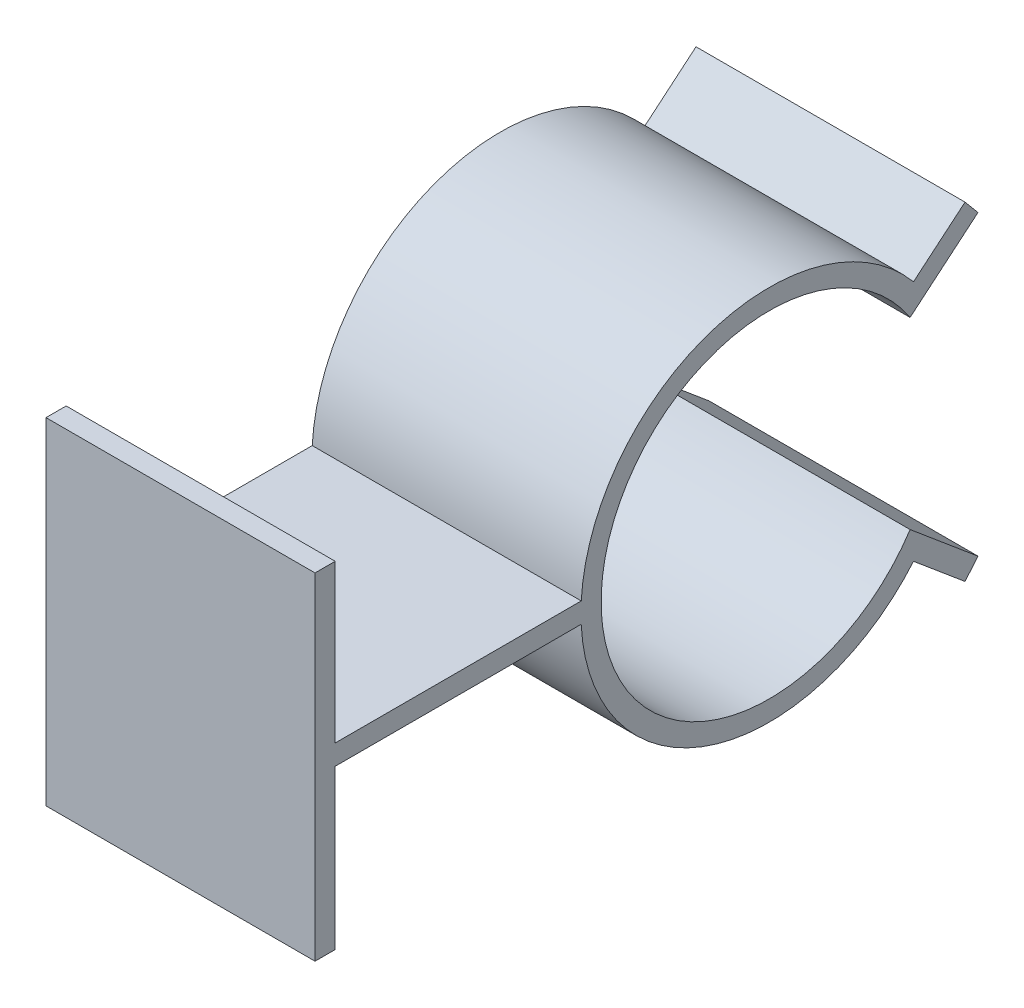
ISO-10303-21;
HEADER;
FILE_DESCRIPTION(('STEP AP214'),'2;1');
FILE_NAME('part.step','',(''),(''),'','','');
FILE_SCHEMA(('AUTOMOTIVE_DESIGN { 1 0 10303 214 1 1 1 1 }'));
ENDSEC;
DATA;
#1=APPLICATION_CONTEXT('core data for automotive mechanical design processes');
#2=APPLICATION_PROTOCOL_DEFINITION('international standard','automotive_design',2000,#1);
#3=PRODUCT_CONTEXT('',#1,'mechanical');
#4=PRODUCT('Part','Part','',(#3));
#5=PRODUCT_RELATED_PRODUCT_CATEGORY('part','',(#4));
#6=PRODUCT_DEFINITION_FORMATION('','',#4);
#7=PRODUCT_DEFINITION_CONTEXT('part definition',#1,'design');
#8=PRODUCT_DEFINITION('design','',#6,#7);
#9=PRODUCT_DEFINITION_SHAPE('','',#8);
#10=(LENGTH_UNIT() NAMED_UNIT(*) SI_UNIT(.MILLI.,.METRE.));
#11=(NAMED_UNIT(*) PLANE_ANGLE_UNIT() SI_UNIT($,.RADIAN.));
#12=(NAMED_UNIT(*) SI_UNIT($,.STERADIAN.) SOLID_ANGLE_UNIT());
#13=UNCERTAINTY_MEASURE_WITH_UNIT(LENGTH_MEASURE(1.E-05),#10,'distance_accuracy_value','');
#14=(GEOMETRIC_REPRESENTATION_CONTEXT(3) GLOBAL_UNCERTAINTY_ASSIGNED_CONTEXT((#13)) GLOBAL_UNIT_ASSIGNED_CONTEXT((#10,
#11,#12)) REPRESENTATION_CONTEXT('',''));
#15=CARTESIAN_POINT('',(0.,0.,0.));
#16=DIRECTION('',(0.,0.,1.));
#17=DIRECTION('',(1.,0.,0.));
#18=AXIS2_PLACEMENT_3D('',#15,#16,#17);
#19=CARTESIAN_POINT('',(362.500000000001,655.801592781711,0.));
#20=DIRECTION('',(0.,-1.,0.));
#21=DIRECTION('',(1.,0.,0.));
#22=AXIS2_PLACEMENT_3D('',#19,#20,#21);
#23=PLANE('',#22);
#24=DIRECTION('',(0.,0.,-1.));
#25=VECTOR('',#24,1.);
#26=CARTESIAN_POINT('',(382.500000000001,655.801592781711,0.));
#27=LINE('',#26,#25);
#28=CARTESIAN_POINT('',(382.500000000001,655.801592781711,32.2691453664121));
#29=VERTEX_POINT('',#28);
#30=CARTESIAN_POINT('',(382.500000000001,655.801592781711,13.9770329116128));
#31=VERTEX_POINT('',#30);
#32=EDGE_CURVE('E179',#29,#31,#27,.T.);
#33=ORIENTED_EDGE('',*,*,#32,.T.);
#34=DIRECTION('',(1.,0.,0.));
#35=VECTOR('',#34,1.);
#36=CARTESIAN_POINT('',(362.500000000001,655.801592781711,13.9770329116128));
#37=LINE('',#36,#35);
#38=CARTESIAN_POINT('',(362.500000000001,655.801592781711,13.9770329116128));
#39=VERTEX_POINT('',#38);
#40=EDGE_CURVE('E11',#39,#31,#37,.T.);
#41=ORIENTED_EDGE('',*,*,#40,.F.);
#42=DIRECTION('',(0.,0.,-1.));
#43=VECTOR('',#42,1.);
#44=CARTESIAN_POINT('',(362.500000000001,655.801592781711,0.));
#45=LINE('',#44,#43);
#46=CARTESIAN_POINT('',(362.500000000001,655.801592781711,32.2691453664121));
#47=VERTEX_POINT('',#46);
#48=EDGE_CURVE('E218',#47,#39,#45,.T.);
#49=ORIENTED_EDGE('',*,*,#48,.F.);
#50=DIRECTION('',(1.,0.,0.));
#51=VECTOR('',#50,1.);
#52=CARTESIAN_POINT('',(362.500000000001,655.801592781711,32.2691453664121));
#53=LINE('',#52,#51);
#54=EDGE_CURVE('E178',#47,#29,#53,.T.);
#55=ORIENTED_EDGE('',*,*,#54,.T.);
#56=EDGE_LOOP('',(#33,#41,#49,#55));
#57=FACE_BOUND('',#56,.T.);
#58=ADVANCED_FACE('F34',(#57),#23,.F.);
#59=CARTESIAN_POINT('',(362.500000000001,655.,0.));
#60=DIRECTION('',(1.,0.,0.));
#61=DIRECTION('',(0.,1.,0.));
#62=AXIS2_PLACEMENT_3D('',#59,#60,#61);
#63=CYLINDRICAL_SURFACE('',#62,14.);
#64=CARTESIAN_POINT('',(382.500000000001,655.,0.));
#65=DIRECTION('',(-1.,0.,0.));
#66=DIRECTION('',(0.,0.,1.));
#67=AXIS2_PLACEMENT_3D('',#64,#65,#66);
#68=CIRCLE('',#67,14.);
#69=CARTESIAN_POINT('',(382.500000000001,663.999026535612,-10.7246222036657));
#70=VERTEX_POINT('',#69);
#71=EDGE_CURVE('E182',#31,#70,#68,.T.);
#72=ORIENTED_EDGE('',*,*,#71,.T.);
#73=DIRECTION('',(1.,0.,0.));
#74=VECTOR('',#73,1.);
#75=CARTESIAN_POINT('',(362.500000000001,663.999026535612,-10.7246222036657));
#76=LINE('',#75,#74);
#77=CARTESIAN_POINT('',(362.500000000001,663.999026535612,-10.7246222036657));
#78=VERTEX_POINT('',#77);
#79=EDGE_CURVE('E42',#78,#70,#76,.T.);
#80=ORIENTED_EDGE('',*,*,#79,.F.);
#81=CARTESIAN_POINT('',(362.500000000001,655.,0.));
#82=DIRECTION('',(-1.,0.,0.));
#83=DIRECTION('',(0.,0.,1.));
#84=AXIS2_PLACEMENT_3D('',#81,#82,#83);
#85=CIRCLE('',#84,14.);
#86=EDGE_CURVE('E116',#39,#78,#85,.T.);
#87=ORIENTED_EDGE('',*,*,#86,.F.);
#88=ORIENTED_EDGE('',*,*,#40,.T.);
#89=EDGE_LOOP('',(#72,#80,#87,#88));
#90=FACE_BOUND('',#89,.T.);
#91=ADVANCED_FACE('F309',(#90),#63,.T.);
#92=CARTESIAN_POINT('',(362.500000000001,384.369778185915,322.524539111499));
#93=DIRECTION('',(0.,-0.766044443118973,-0.642787609686545));
#94=DIRECTION('',(0.,0.642787609686545,-0.766044443118973));
#95=AXIS2_PLACEMENT_3D('',#92,#93,#94);
#96=PLANE('',#95);
#97=DIRECTION('',(0.,0.642787609686545,-0.766044443118973));
#98=VECTOR('',#97,1.);
#99=CARTESIAN_POINT('',(382.500000000001,384.369778185915,322.524539111499));
#100=LINE('',#99,#98);
#101=CARTESIAN_POINT('',(382.500000000001,667.212964584045,-14.5548444192606));
#102=VERTEX_POINT('',#101);
#103=EDGE_CURVE('E184',#70,#102,#100,.T.);
#104=ORIENTED_EDGE('',*,*,#103,.T.);
#105=DIRECTION('',(1.,0.,0.));
#106=VECTOR('',#105,1.);
#107=CARTESIAN_POINT('',(362.500000000001,667.212964584045,-14.5548444192606));
#108=LINE('',#107,#106);
#109=CARTESIAN_POINT('',(362.500000000001,667.212964584045,-14.5548444192606));
#110=VERTEX_POINT('',#109);
#111=EDGE_CURVE('E241',#110,#102,#108,.T.);
#112=ORIENTED_EDGE('',*,*,#111,.F.);
#113=DIRECTION('',(0.,0.642787609686545,-0.766044443118973));
#114=VECTOR('',#113,1.);
#115=CARTESIAN_POINT('',(362.500000000001,384.369778185915,322.524539111499));
#116=LINE('',#115,#114);
#117=EDGE_CURVE('E249',#78,#110,#116,.T.);
#118=ORIENTED_EDGE('',*,*,#117,.F.);
#119=ORIENTED_EDGE('',*,*,#79,.T.);
#120=EDGE_LOOP('',(#104,#112,#118,#119));
#121=FACE_BOUND('',#120,.T.);
#122=ADVANCED_FACE('F247',(#121),#96,.F.);
#123=CARTESIAN_POINT('',(362.500000000001,282.843186398093,-337.079383530754));
#124=DIRECTION('',(0.,-0.642787609686503,0.766044443119009));
#125=DIRECTION('',(0.,-0.766044443119009,-0.642787609686503));
#126=AXIS2_PLACEMENT_3D('',#123,#124,#125);
#127=PLANE('',#126);
#128=DIRECTION('',(0.,-0.766044443119009,-0.642787609686503));
#129=VECTOR('',#128,1.);
#130=CARTESIAN_POINT('',(382.500000000001,282.843186398093,-337.079383530754));
#131=LINE('',#130,#129);
#132=CARTESIAN_POINT('',(382.500000000001,666.063897919366,-15.5190258337903));
#133=VERTEX_POINT('',#132);
#134=EDGE_CURVE('E186',#102,#133,#131,.T.);
#135=ORIENTED_EDGE('',*,*,#134,.T.);
#136=DIRECTION('',(1.,0.,0.));
#137=VECTOR('',#136,1.);
#138=CARTESIAN_POINT('',(362.500000000001,666.063897919366,-15.5190258337903));
#139=LINE('',#138,#137);
#140=CARTESIAN_POINT('',(362.500000000001,666.063897919366,-15.5190258337903));
#141=VERTEX_POINT('',#140);
#142=EDGE_CURVE('E238',#141,#133,#139,.T.);
#143=ORIENTED_EDGE('',*,*,#142,.F.);
#144=DIRECTION('',(0.,-0.766044443119009,-0.642787609686503));
#145=VECTOR('',#144,1.);
#146=CARTESIAN_POINT('',(362.500000000001,282.843186398093,-337.079383530754));
#147=LINE('',#146,#145);
#148=EDGE_CURVE('E267',#110,#141,#147,.T.);
#149=ORIENTED_EDGE('',*,*,#148,.F.);
#150=ORIENTED_EDGE('',*,*,#111,.T.);
#151=EDGE_LOOP('',(#135,#143,#149,#150));
#152=FACE_BOUND('',#151,.T.);
#153=ADVANCED_FACE('F257',(#152),#127,.F.);
#154=CARTESIAN_POINT('',(362.500000000001,383.220711521241,321.560357696968));
#155=DIRECTION('',(0.,0.766044443118977,0.64278760968654));
#156=DIRECTION('',(0.,-0.64278760968654,0.766044443118977));
#157=AXIS2_PLACEMENT_3D('',#154,#155,#156);
#158=PLANE('',#157);
#159=DIRECTION('',(0.,-0.64278760968654,0.766044443118977));
#160=VECTOR('',#159,1.);
#161=CARTESIAN_POINT('',(382.500000000001,383.220711521241,321.560357696968));
#162=LINE('',#161,#160);
#163=CARTESIAN_POINT('',(382.500000000001,661.827717795218,-10.4705429519611));
#164=VERTEX_POINT('',#163);
#165=EDGE_CURVE('E188',#133,#164,#162,.T.);
#166=ORIENTED_EDGE('',*,*,#165,.T.);
#167=DIRECTION('',(1.,0.,0.));
#168=VECTOR('',#167,1.);
#169=CARTESIAN_POINT('',(362.500000000001,661.827717795218,-10.4705429519611));
#170=LINE('',#169,#168);
#171=CARTESIAN_POINT('',(362.500000000001,661.827717795218,-10.4705429519611));
#172=VERTEX_POINT('',#171);
#173=EDGE_CURVE('E236',#172,#164,#170,.T.);
#174=ORIENTED_EDGE('',*,*,#173,.F.);
#175=DIRECTION('',(0.,-0.64278760968654,0.766044443118977));
#176=VECTOR('',#175,1.);
#177=CARTESIAN_POINT('',(362.500000000001,383.220711521241,321.560357696968));
#178=LINE('',#177,#176);
#179=EDGE_CURVE('E263',#141,#172,#178,.T.);
#180=ORIENTED_EDGE('',*,*,#179,.F.);
#181=ORIENTED_EDGE('',*,*,#142,.T.);
#182=EDGE_LOOP('',(#166,#174,#180,#181));
#183=FACE_BOUND('',#182,.T.);
#184=ADVANCED_FACE('F261',(#183),#158,.F.);
#185=CARTESIAN_POINT('',(362.500000000001,655.,0.));
#186=DIRECTION('',(1.,0.,0.));
#187=DIRECTION('',(0.,1.,0.));
#188=AXIS2_PLACEMENT_3D('',#185,#186,#187);
#189=CYLINDRICAL_SURFACE('',#188,12.4999999999999);
#190=CARTESIAN_POINT('',(382.500000000001,655.,0.));
#191=DIRECTION('',(-1.,0.,0.));
#192=DIRECTION('',(0.,0.,1.));
#193=AXIS2_PLACEMENT_3D('',#190,#191,#192);
#194=CIRCLE('',#193,12.4999999999999);
#195=CARTESIAN_POINT('',(382.500000000001,648.172282204782,-10.4705429519611));
#196=VERTEX_POINT('',#195);
#197=EDGE_CURVE('E191',#196,#164,#194,.T.);
#198=ORIENTED_EDGE('',*,*,#197,.F.);
#199=DIRECTION('',(1.,0.,0.));
#200=VECTOR('',#199,1.);
#201=CARTESIAN_POINT('',(362.500000000001,648.172282204782,-10.4705429519611));
#202=LINE('',#201,#200);
#203=CARTESIAN_POINT('',(362.500000000001,648.172282204782,-10.4705429519611));
#204=VERTEX_POINT('',#203);
#205=EDGE_CURVE('E234',#204,#196,#202,.T.);
#206=ORIENTED_EDGE('',*,*,#205,.F.);
#207=CARTESIAN_POINT('',(362.500000000001,655.,0.));
#208=DIRECTION('',(-1.,0.,0.));
#209=DIRECTION('',(0.,0.,1.));
#210=AXIS2_PLACEMENT_3D('',#207,#208,#209);
#211=CIRCLE('',#210,12.4999999999999);
#212=EDGE_CURVE('E266',#204,#172,#211,.T.);
#213=ORIENTED_EDGE('',*,*,#212,.T.);
#214=ORIENTED_EDGE('',*,*,#173,.T.);
#215=EDGE_LOOP('',(#198,#206,#213,#214));
#216=FACE_BOUND('',#215,.T.);
#217=ADVANCED_FACE('F322',(#216),#189,.F.);
#218=CARTESIAN_POINT('',(362.500000000001,385.518844850598,-323.488720526028));
#219=DIRECTION('',(0.,0.766044443118977,-0.64278760968654));
#220=DIRECTION('',(0.,0.64278760968654,0.766044443118977));
#221=AXIS2_PLACEMENT_3D('',#218,#219,#220);
#222=PLANE('',#221);
#223=DIRECTION('',(0.,0.64278760968654,0.766044443118977));
#224=VECTOR('',#223,1.);
#225=CARTESIAN_POINT('',(382.500000000001,385.518844850598,-323.488720526028));
#226=LINE('',#225,#224);
#227=CARTESIAN_POINT('',(382.500000000001,643.936102080635,-15.5190258337904));
#228=VERTEX_POINT('',#227);
#229=EDGE_CURVE('E194',#228,#196,#226,.T.);
#230=ORIENTED_EDGE('',*,*,#229,.F.);
#231=DIRECTION('',(1.,0.,0.));
#232=VECTOR('',#231,1.);
#233=CARTESIAN_POINT('',(362.500000000001,643.936102080635,-15.5190258337904));
#234=LINE('',#233,#232);
#235=CARTESIAN_POINT('',(362.500000000001,643.936102080635,-15.5190258337904));
#236=VERTEX_POINT('',#235);
#237=EDGE_CURVE('E232',#236,#228,#234,.T.);
#238=ORIENTED_EDGE('',*,*,#237,.F.);
#239=DIRECTION('',(0.,0.64278760968654,0.766044443118977));
#240=VECTOR('',#239,1.);
#241=CARTESIAN_POINT('',(362.500000000001,385.518844850598,-323.488720526028));
#242=LINE('',#241,#240);
#243=EDGE_CURVE('E269',#236,#204,#242,.T.);
#244=ORIENTED_EDGE('',*,*,#243,.T.);
#245=ORIENTED_EDGE('',*,*,#205,.T.);
#246=EDGE_LOOP('',(#230,#238,#244,#245));
#247=FACE_BOUND('',#246,.T.);
#248=ADVANCED_FACE('F325',(#247),#222,.T.);
#249=CARTESIAN_POINT('',(362.500000000001,258.417257230006,307.969694692232));
#250=DIRECTION('',(0.,-0.642787609686503,-0.766044443119009));
#251=DIRECTION('',(0.,0.766044443119009,-0.642787609686503));
#252=AXIS2_PLACEMENT_3D('',#249,#250,#251);
#253=PLANE('',#252);
#254=DIRECTION('',(0.,0.766044443119009,-0.642787609686503));
#255=VECTOR('',#254,1.);
#256=CARTESIAN_POINT('',(382.500000000001,258.417257230006,307.969694692232));
#257=LINE('',#256,#255);
#258=CARTESIAN_POINT('',(382.500000000001,642.787035415956,-14.5548444192605));
#259=VERTEX_POINT('',#258);
#260=EDGE_CURVE('E197',#259,#228,#257,.T.);
#261=ORIENTED_EDGE('',*,*,#260,.F.);
#262=DIRECTION('',(1.,0.,0.));
#263=VECTOR('',#262,1.);
#264=CARTESIAN_POINT('',(362.500000000001,642.787035415956,-14.5548444192605));
#265=LINE('',#264,#263);
#266=CARTESIAN_POINT('',(362.500000000001,642.787035415956,-14.5548444192605));
#267=VERTEX_POINT('',#266);
#268=EDGE_CURVE('E230',#267,#259,#265,.T.);
#269=ORIENTED_EDGE('',*,*,#268,.F.);
#270=DIRECTION('',(0.,0.766044443119009,-0.642787609686503));
#271=VECTOR('',#270,1.);
#272=CARTESIAN_POINT('',(362.500000000001,258.417257230006,307.969694692232));
#273=LINE('',#272,#271);
#274=EDGE_CURVE('E276',#267,#236,#273,.T.);
#275=ORIENTED_EDGE('',*,*,#274,.T.);
#276=ORIENTED_EDGE('',*,*,#237,.T.);
#277=EDGE_LOOP('',(#261,#269,#275,#276));
#278=FACE_BOUND('',#277,.T.);
#279=ADVANCED_FACE('F329',(#278),#253,.T.);
#280=CARTESIAN_POINT('',(362.500000000001,384.369778185915,-322.524539111499));
#281=DIRECTION('',(0.,-0.766044443118973,0.642787609686545));
#282=DIRECTION('',(0.,-0.642787609686545,-0.766044443118973));
#283=AXIS2_PLACEMENT_3D('',#280,#281,#282);
#284=PLANE('',#283);
#285=DIRECTION('',(0.,-0.642787609686545,-0.766044443118973));
#286=VECTOR('',#285,1.);
#287=CARTESIAN_POINT('',(382.500000000001,384.369778185915,-322.524539111499));
#288=LINE('',#287,#286);
#289=CARTESIAN_POINT('',(382.500000000001,646.000973464389,-10.7246222036657));
#290=VERTEX_POINT('',#289);
#291=EDGE_CURVE('E200',#290,#259,#288,.T.);
#292=ORIENTED_EDGE('',*,*,#291,.F.);
#293=DIRECTION('',(1.,0.,0.));
#294=VECTOR('',#293,1.);
#295=CARTESIAN_POINT('',(362.500000000001,646.000973464389,-10.7246222036657));
#296=LINE('',#295,#294);
#297=CARTESIAN_POINT('',(362.500000000001,646.000973464389,-10.7246222036657));
#298=VERTEX_POINT('',#297);
#299=EDGE_CURVE('E228',#298,#290,#296,.T.);
#300=ORIENTED_EDGE('',*,*,#299,.F.);
#301=DIRECTION('',(0.,-0.642787609686545,-0.766044443118973));
#302=VECTOR('',#301,1.);
#303=CARTESIAN_POINT('',(362.500000000001,384.369778185915,-322.524539111499));
#304=LINE('',#303,#302);
#305=EDGE_CURVE('E279',#298,#267,#304,.T.);
#306=ORIENTED_EDGE('',*,*,#305,.T.);
#307=ORIENTED_EDGE('',*,*,#268,.T.);
#308=EDGE_LOOP('',(#292,#300,#306,#307));
#309=FACE_BOUND('',#308,.T.);
#310=ADVANCED_FACE('F333',(#309),#284,.T.);
#311=CARTESIAN_POINT('',(362.500000000001,655.,0.));
#312=DIRECTION('',(1.,0.,0.));
#313=DIRECTION('',(0.,1.,0.));
#314=AXIS2_PLACEMENT_3D('',#311,#312,#313);
#315=CYLINDRICAL_SURFACE('',#314,14.);
#316=CARTESIAN_POINT('',(382.500000000001,655.,0.));
#317=DIRECTION('',(-1.,0.,0.));
#318=DIRECTION('',(0.,0.,1.));
#319=AXIS2_PLACEMENT_3D('',#316,#317,#318);
#320=CIRCLE('',#319,14.);
#321=CARTESIAN_POINT('',(382.500000000001,654.301592781711,13.9825686966823));
#322=VERTEX_POINT('',#321);
#323=EDGE_CURVE('E203',#290,#322,#320,.T.);
#324=ORIENTED_EDGE('',*,*,#323,.T.);
#325=DIRECTION('',(1.,0.,0.));
#326=VECTOR('',#325,1.);
#327=CARTESIAN_POINT('',(362.500000000001,654.301592781711,13.9825686966823));
#328=LINE('',#327,#326);
#329=CARTESIAN_POINT('',(362.500000000001,654.301592781711,13.9825686966823));
#330=VERTEX_POINT('',#329);
#331=EDGE_CURVE('E226',#330,#322,#328,.T.);
#332=ORIENTED_EDGE('',*,*,#331,.F.);
#333=CARTESIAN_POINT('',(362.500000000001,655.,0.));
#334=DIRECTION('',(-1.,0.,0.));
#335=DIRECTION('',(0.,0.,1.));
#336=AXIS2_PLACEMENT_3D('',#333,#334,#335);
#337=CIRCLE('',#336,14.);
#338=EDGE_CURVE('E282',#298,#330,#337,.T.);
#339=ORIENTED_EDGE('',*,*,#338,.F.);
#340=ORIENTED_EDGE('',*,*,#299,.T.);
#341=EDGE_LOOP('',(#324,#332,#339,#340));
#342=FACE_BOUND('',#341,.T.);
#343=ADVANCED_FACE('F337',(#342),#315,.T.);
#344=CARTESIAN_POINT('',(362.500000000001,654.301592781711,0.));
#345=DIRECTION('',(0.,-1.,0.));
#346=DIRECTION('',(1.,0.,0.));
#347=AXIS2_PLACEMENT_3D('',#344,#345,#346);
#348=PLANE('',#347);
#349=DIRECTION('',(0.,0.,-1.));
#350=VECTOR('',#349,1.);
#351=CARTESIAN_POINT('',(382.500000000001,654.301592781711,0.));
#352=LINE('',#351,#350);
#353=CARTESIAN_POINT('',(382.500000000001,654.301592781711,32.2691453664121));
#354=VERTEX_POINT('',#353);
#355=EDGE_CURVE('E206',#354,#322,#352,.T.);
#356=ORIENTED_EDGE('',*,*,#355,.F.);
#357=DIRECTION('',(1.,0.,0.));
#358=VECTOR('',#357,1.);
#359=CARTESIAN_POINT('',(362.500000000001,654.301592781711,32.2691453664121));
#360=LINE('',#359,#358);
#361=CARTESIAN_POINT('',(362.500000000001,654.301592781711,32.2691453664121));
#362=VERTEX_POINT('',#361);
#363=EDGE_CURVE('E224',#362,#354,#360,.T.);
#364=ORIENTED_EDGE('',*,*,#363,.F.);
#365=DIRECTION('',(0.,0.,-1.));
#366=VECTOR('',#365,1.);
#367=CARTESIAN_POINT('',(362.500000000001,654.301592781711,0.));
#368=LINE('',#367,#366);
#369=EDGE_CURVE('E284',#362,#330,#368,.T.);
#370=ORIENTED_EDGE('',*,*,#369,.T.);
#371=ORIENTED_EDGE('',*,*,#331,.T.);
#372=EDGE_LOOP('',(#356,#364,#370,#371));
#373=FACE_BOUND('',#372,.T.);
#374=ADVANCED_FACE('F341',(#373),#348,.T.);
#375=CARTESIAN_POINT('',(362.500000000001,0.,32.2691453664121));
#376=DIRECTION('',(0.,0.,1.));
#377=DIRECTION('',(1.,0.,0.));
#378=AXIS2_PLACEMENT_3D('',#375,#376,#377);
#379=PLANE('',#378);
#380=DIRECTION('',(0.,-1.,0.));
#381=VECTOR('',#380,1.);
#382=CARTESIAN_POINT('',(382.500000000001,0.,32.2691453664121));
#383=LINE('',#382,#381);
#384=CARTESIAN_POINT('',(382.500000000001,642.5,32.2691453664121));
#385=VERTEX_POINT('',#384);
#386=EDGE_CURVE('E209',#354,#385,#383,.T.);
#387=ORIENTED_EDGE('',*,*,#386,.T.);
#388=DIRECTION('',(1.,0.,0.));
#389=VECTOR('',#388,1.);
#390=CARTESIAN_POINT('',(362.500000000001,642.5,32.2691453664121));
#391=LINE('',#390,#389);
#392=CARTESIAN_POINT('',(362.500000000001,642.5,32.2691453664121));
#393=VERTEX_POINT('',#392);
#394=EDGE_CURVE('E222',#393,#385,#391,.T.);
#395=ORIENTED_EDGE('',*,*,#394,.F.);
#396=DIRECTION('',(0.,-1.,0.));
#397=VECTOR('',#396,1.);
#398=CARTESIAN_POINT('',(362.500000000001,0.,32.2691453664121));
#399=LINE('',#398,#397);
#400=EDGE_CURVE('E173',#362,#393,#399,.T.);
#401=ORIENTED_EDGE('',*,*,#400,.F.);
#402=ORIENTED_EDGE('',*,*,#363,.T.);
#403=EDGE_LOOP('',(#387,#395,#401,#402));
#404=FACE_BOUND('',#403,.T.);
#405=ADVANCED_FACE('F290',(#404),#379,.F.);
#406=CARTESIAN_POINT('',(362.500000000001,642.5,0.));
#407=DIRECTION('',(0.,-1.,0.));
#408=DIRECTION('',(1.,0.,0.));
#409=AXIS2_PLACEMENT_3D('',#406,#407,#408);
#410=PLANE('',#409);
#411=DIRECTION('',(0.,0.,-1.));
#412=VECTOR('',#411,1.);
#413=CARTESIAN_POINT('',(382.500000000001,642.5,0.));
#414=LINE('',#413,#412);
#415=CARTESIAN_POINT('',(382.500000000001,642.5,33.7691453664121));
#416=VERTEX_POINT('',#415);
#417=EDGE_CURVE('E212',#416,#385,#414,.T.);
#418=ORIENTED_EDGE('',*,*,#417,.F.);
#419=DIRECTION('',(1.,0.,0.));
#420=VECTOR('',#419,1.);
#421=CARTESIAN_POINT('',(362.500000000001,642.5,33.7691453664121));
#422=LINE('',#421,#420);
#423=CARTESIAN_POINT('',(362.500000000001,642.5,33.7691453664121));
#424=VERTEX_POINT('',#423);
#425=EDGE_CURVE('E162',#424,#416,#422,.T.);
#426=ORIENTED_EDGE('',*,*,#425,.F.);
#427=DIRECTION('',(0.,0.,-1.));
#428=VECTOR('',#427,1.);
#429=CARTESIAN_POINT('',(362.500000000001,642.5,0.));
#430=LINE('',#429,#428);
#431=EDGE_CURVE('E171',#424,#393,#430,.T.);
#432=ORIENTED_EDGE('',*,*,#431,.T.);
#433=ORIENTED_EDGE('',*,*,#394,.T.);
#434=EDGE_LOOP('',(#418,#426,#432,#433));
#435=FACE_BOUND('',#434,.T.);
#436=ADVANCED_FACE('F294',(#435),#410,.T.);
#437=CARTESIAN_POINT('',(362.500000000001,0.,33.7691453664121));
#438=DIRECTION('',(0.,0.,1.));
#439=DIRECTION('',(1.,0.,0.));
#440=AXIS2_PLACEMENT_3D('',#437,#438,#439);
#441=PLANE('',#440);
#442=DIRECTION('',(0.,-1.,0.));
#443=VECTOR('',#442,1.);
#444=CARTESIAN_POINT('',(382.500000000001,0.,33.7691453664121));
#445=LINE('',#444,#443);
#446=CARTESIAN_POINT('',(382.500000000001,667.5,33.7691453664121));
#447=VERTEX_POINT('',#446);
#448=EDGE_CURVE('E161',#447,#416,#445,.T.);
#449=ORIENTED_EDGE('',*,*,#448,.F.);
#450=DIRECTION('',(1.,0.,0.));
#451=VECTOR('',#450,1.);
#452=CARTESIAN_POINT('',(362.500000000001,667.5,33.7691453664121));
#453=LINE('',#452,#451);
#454=CARTESIAN_POINT('',(362.500000000001,667.5,33.7691453664121));
#455=VERTEX_POINT('',#454);
#456=EDGE_CURVE('E155',#455,#447,#453,.T.);
#457=ORIENTED_EDGE('',*,*,#456,.F.);
#458=DIRECTION('',(0.,-1.,0.));
#459=VECTOR('',#458,1.);
#460=CARTESIAN_POINT('',(362.500000000001,0.,33.7691453664121));
#461=LINE('',#460,#459);
#462=EDGE_CURVE('E159',#455,#424,#461,.T.);
#463=ORIENTED_EDGE('',*,*,#462,.T.);
#464=ORIENTED_EDGE('',*,*,#425,.T.);
#465=EDGE_LOOP('',(#449,#457,#463,#464));
#466=FACE_BOUND('',#465,.T.);
#467=ADVANCED_FACE('F157',(#466),#441,.T.);
#468=CARTESIAN_POINT('',(362.500000000001,667.5,0.));
#469=DIRECTION('',(0.,-1.,0.));
#470=DIRECTION('',(1.,0.,0.));
#471=AXIS2_PLACEMENT_3D('',#468,#469,#470);
#472=PLANE('',#471);
#473=DIRECTION('',(0.,0.,-1.));
#474=VECTOR('',#473,1.);
#475=CARTESIAN_POINT('',(382.500000000001,667.5,0.));
#476=LINE('',#475,#474);
#477=CARTESIAN_POINT('',(382.500000000001,667.5,32.2691453664121));
#478=VERTEX_POINT('',#477);
#479=EDGE_CURVE('E102',#447,#478,#476,.T.);
#480=ORIENTED_EDGE('',*,*,#479,.T.);
#481=DIRECTION('',(1.,0.,0.));
#482=VECTOR('',#481,1.);
#483=CARTESIAN_POINT('',(362.500000000001,667.5,32.2691453664121));
#484=LINE('',#483,#482);
#485=CARTESIAN_POINT('',(362.500000000001,667.5,32.2691453664121));
#486=VERTEX_POINT('',#485);
#487=EDGE_CURVE('E163',#486,#478,#484,.T.);
#488=ORIENTED_EDGE('',*,*,#487,.F.);
#489=DIRECTION('',(0.,0.,-1.));
#490=VECTOR('',#489,1.);
#491=CARTESIAN_POINT('',(362.500000000001,667.5,0.));
#492=LINE('',#491,#490);
#493=EDGE_CURVE('E165',#455,#486,#492,.T.);
#494=ORIENTED_EDGE('',*,*,#493,.F.);
#495=ORIENTED_EDGE('',*,*,#456,.T.);
#496=EDGE_LOOP('',(#480,#488,#494,#495));
#497=FACE_BOUND('',#496,.T.);
#498=ADVANCED_FACE('F166',(#497),#472,.F.);
#499=CARTESIAN_POINT('',(362.500000000001,0.,32.2691453664121));
#500=DIRECTION('',(0.,0.,1.));
#501=DIRECTION('',(1.,0.,0.));
#502=AXIS2_PLACEMENT_3D('',#499,#500,#501);
#503=PLANE('',#502);
#504=DIRECTION('',(0.,-1.,0.));
#505=VECTOR('',#504,1.);
#506=CARTESIAN_POINT('',(382.500000000001,0.,32.2691453664121));
#507=LINE('',#506,#505);
#508=EDGE_CURVE('E108',#478,#29,#507,.T.);
#509=ORIENTED_EDGE('',*,*,#508,.T.);
#510=ORIENTED_EDGE('',*,*,#54,.F.);
#511=DIRECTION('',(0.,-1.,0.));
#512=VECTOR('',#511,1.);
#513=CARTESIAN_POINT('',(362.500000000001,0.,32.2691453664121));
#514=LINE('',#513,#512);
#515=EDGE_CURVE('E50',#486,#47,#514,.T.);
#516=ORIENTED_EDGE('',*,*,#515,.F.);
#517=ORIENTED_EDGE('',*,*,#487,.T.);
#518=EDGE_LOOP('',(#509,#510,#516,#517));
#519=FACE_BOUND('',#518,.T.);
#520=ADVANCED_FACE('F298',(#519),#503,.F.);
#521=CARTESIAN_POINT('',(362.500000000001,0.,0.));
#522=DIRECTION('',(-1.,0.,0.));
#523=DIRECTION('',(0.,0.,1.));
#524=AXIS2_PLACEMENT_3D('',#521,#522,#523);
#525=PLANE('',#524);
#526=ORIENTED_EDGE('',*,*,#48,.T.);
#527=ORIENTED_EDGE('',*,*,#86,.T.);
#528=ORIENTED_EDGE('',*,*,#117,.T.);
#529=ORIENTED_EDGE('',*,*,#148,.T.);
#530=ORIENTED_EDGE('',*,*,#179,.T.);
#531=ORIENTED_EDGE('',*,*,#212,.F.);
#532=ORIENTED_EDGE('',*,*,#243,.F.);
#533=ORIENTED_EDGE('',*,*,#274,.F.);
#534=ORIENTED_EDGE('',*,*,#305,.F.);
#535=ORIENTED_EDGE('',*,*,#338,.T.);
#536=ORIENTED_EDGE('',*,*,#369,.F.);
#537=ORIENTED_EDGE('',*,*,#400,.T.);
#538=ORIENTED_EDGE('',*,*,#431,.F.);
#539=ORIENTED_EDGE('',*,*,#462,.F.);
#540=ORIENTED_EDGE('',*,*,#493,.T.);
#541=ORIENTED_EDGE('',*,*,#515,.T.);
#542=EDGE_LOOP('',(#526,#527,#528,#529,#530,#531,#532,#533,#534,#535,#536,#537,#538,#539,#540,#541));
#543=FACE_BOUND('',#542,.T.);
#544=ADVANCED_FACE('F169',(#543),#525,.T.);
#545=CARTESIAN_POINT('',(382.500000000001,0.,0.));
#546=DIRECTION('',(-1.,0.,0.));
#547=DIRECTION('',(0.,0.,1.));
#548=AXIS2_PLACEMENT_3D('',#545,#546,#547);
#549=PLANE('',#548);
#550=ORIENTED_EDGE('',*,*,#32,.F.);
#551=ORIENTED_EDGE('',*,*,#508,.F.);
#552=ORIENTED_EDGE('',*,*,#479,.F.);
#553=ORIENTED_EDGE('',*,*,#448,.T.);
#554=ORIENTED_EDGE('',*,*,#417,.T.);
#555=ORIENTED_EDGE('',*,*,#386,.F.);
#556=ORIENTED_EDGE('',*,*,#355,.T.);
#557=ORIENTED_EDGE('',*,*,#323,.F.);
#558=ORIENTED_EDGE('',*,*,#291,.T.);
#559=ORIENTED_EDGE('',*,*,#260,.T.);
#560=ORIENTED_EDGE('',*,*,#229,.T.);
#561=ORIENTED_EDGE('',*,*,#197,.T.);
#562=ORIENTED_EDGE('',*,*,#165,.F.);
#563=ORIENTED_EDGE('',*,*,#134,.F.);
#564=ORIENTED_EDGE('',*,*,#103,.F.);
#565=ORIENTED_EDGE('',*,*,#71,.F.);
#566=EDGE_LOOP('',(#550,#551,#552,#553,#554,#555,#556,#557,#558,#559,#560,#561,#562,#563,#564,#565));
#567=FACE_BOUND('',#566,.T.);
#568=ADVANCED_FACE('F253',(#567),#549,.F.);
#569=CLOSED_SHELL('',(#58,#91,#122,#153,#184,#217,#248,#279,#310,#343,#374,#405,#436,#467,#498,
#520,#544,#568));
#570=MANIFOLD_SOLID_BREP('B2',#569);
#571=ADVANCED_BREP_SHAPE_REPRESENTATION('',(#18,#570),#14);
#572=SHAPE_DEFINITION_REPRESENTATION(#9,#571);
ENDSEC;
END-ISO-10303-21;
